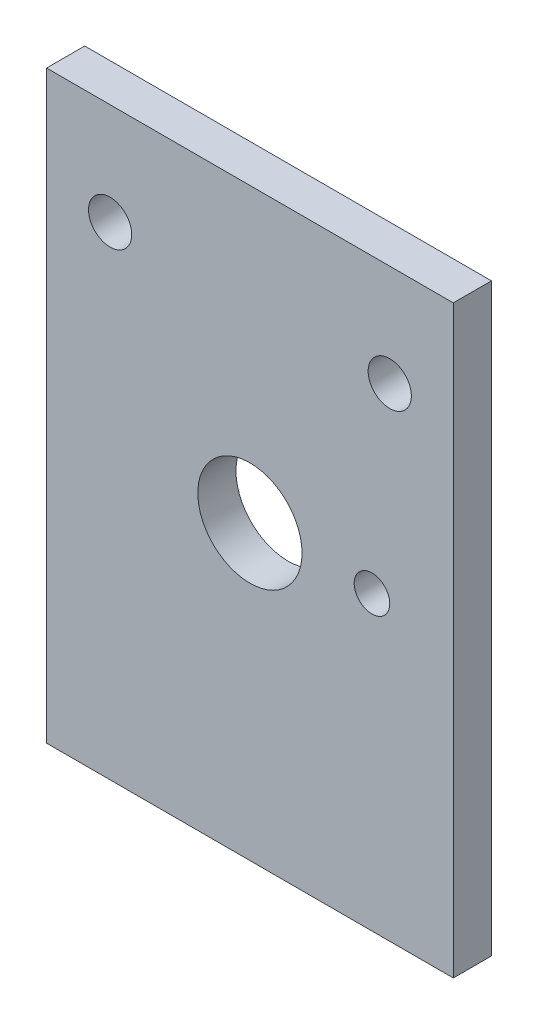
ISO-10303-21;
HEADER;
FILE_DESCRIPTION(('STEP AP214'),'2;1');
FILE_NAME('part.step','',(''),(''),'','','');
FILE_SCHEMA(('AUTOMOTIVE_DESIGN { 1 0 10303 214 1 1 1 1 }'));
ENDSEC;
DATA;
#1=APPLICATION_CONTEXT('core data for automotive mechanical design processes');
#2=APPLICATION_PROTOCOL_DEFINITION('international standard','automotive_design',2000,#1);
#3=PRODUCT_CONTEXT('',#1,'mechanical');
#4=PRODUCT('Part','Part','',(#3));
#5=PRODUCT_RELATED_PRODUCT_CATEGORY('part','',(#4));
#6=PRODUCT_DEFINITION_FORMATION('','',#4);
#7=PRODUCT_DEFINITION_CONTEXT('part definition',#1,'design');
#8=PRODUCT_DEFINITION('design','',#6,#7);
#9=PRODUCT_DEFINITION_SHAPE('','',#8);
#10=(LENGTH_UNIT() NAMED_UNIT(*) SI_UNIT(.MILLI.,.METRE.));
#11=(NAMED_UNIT(*) PLANE_ANGLE_UNIT() SI_UNIT($,.RADIAN.));
#12=(NAMED_UNIT(*) SI_UNIT($,.STERADIAN.) SOLID_ANGLE_UNIT());
#13=UNCERTAINTY_MEASURE_WITH_UNIT(LENGTH_MEASURE(1.E-05),#10,'distance_accuracy_value','');
#14=(GEOMETRIC_REPRESENTATION_CONTEXT(3) GLOBAL_UNCERTAINTY_ASSIGNED_CONTEXT((#13)) GLOBAL_UNIT_ASSIGNED_CONTEXT((#10,
#11,#12)) REPRESENTATION_CONTEXT('',''));
#15=CARTESIAN_POINT('',(0.,0.,0.));
#16=DIRECTION('',(0.,0.,1.));
#17=DIRECTION('',(1.,0.,0.));
#18=AXIS2_PLACEMENT_3D('',#15,#16,#17);
#19=CARTESIAN_POINT('',(16.,-23.,-3.));
#20=DIRECTION('',(1.,0.,0.));
#21=DIRECTION('',(0.,0.,-1.));
#22=AXIS2_PLACEMENT_3D('',#19,#20,#21);
#23=PLANE('',#22);
#24=DIRECTION('',(0.,1.,0.));
#25=VECTOR('',#24,1.);
#26=CARTESIAN_POINT('',(16.,-23.,0.));
#27=LINE('',#26,#25);
#28=CARTESIAN_POINT('',(16.,-23.,0.));
#29=VERTEX_POINT('',#28);
#30=CARTESIAN_POINT('',(16.,23.,0.));
#31=VERTEX_POINT('',#30);
#32=EDGE_CURVE('E104',#29,#31,#27,.T.);
#33=ORIENTED_EDGE('',*,*,#32,.F.);
#34=DIRECTION('',(0.,0.,1.));
#35=VECTOR('',#34,1.);
#36=CARTESIAN_POINT('',(16.,-23.,-3.));
#37=LINE('',#36,#35);
#38=CARTESIAN_POINT('',(16.,-23.,-3.));
#39=VERTEX_POINT('',#38);
#40=EDGE_CURVE('E11',#39,#29,#37,.T.);
#41=ORIENTED_EDGE('',*,*,#40,.F.);
#42=DIRECTION('',(0.,1.,0.));
#43=VECTOR('',#42,1.);
#44=CARTESIAN_POINT('',(16.,-23.,-3.));
#45=LINE('',#44,#43);
#46=CARTESIAN_POINT('',(16.,23.,-3.));
#47=VERTEX_POINT('',#46);
#48=EDGE_CURVE('E97',#39,#47,#45,.T.);
#49=ORIENTED_EDGE('',*,*,#48,.T.);
#50=DIRECTION('',(0.,0.,1.));
#51=VECTOR('',#50,1.);
#52=CARTESIAN_POINT('',(16.,23.,-3.));
#53=LINE('',#52,#51);
#54=EDGE_CURVE('E42',#47,#31,#53,.T.);
#55=ORIENTED_EDGE('',*,*,#54,.T.);
#56=EDGE_LOOP('',(#33,#41,#49,#55));
#57=FACE_BOUND('',#56,.T.);
#58=ADVANCED_FACE('F39',(#57),#23,.T.);
#59=CARTESIAN_POINT('',(-16.,-23.,-3.));
#60=DIRECTION('',(0.,-1.,0.));
#61=DIRECTION('',(0.,0.,-1.));
#62=AXIS2_PLACEMENT_3D('',#59,#60,#61);
#63=PLANE('',#62);
#64=DIRECTION('',(1.,0.,0.));
#65=VECTOR('',#64,1.);
#66=CARTESIAN_POINT('',(-16.,-23.,0.));
#67=LINE('',#66,#65);
#68=CARTESIAN_POINT('',(-16.,-23.,0.));
#69=VERTEX_POINT('',#68);
#70=EDGE_CURVE('E99',#69,#29,#67,.T.);
#71=ORIENTED_EDGE('',*,*,#70,.F.);
#72=DIRECTION('',(0.,0.,1.));
#73=VECTOR('',#72,1.);
#74=CARTESIAN_POINT('',(-16.,-23.,-3.));
#75=LINE('',#74,#73);
#76=CARTESIAN_POINT('',(-16.,-23.,-3.));
#77=VERTEX_POINT('',#76);
#78=EDGE_CURVE('E48',#77,#69,#75,.T.);
#79=ORIENTED_EDGE('',*,*,#78,.F.);
#80=DIRECTION('',(1.,0.,0.));
#81=VECTOR('',#80,1.);
#82=CARTESIAN_POINT('',(-16.,-23.,-3.));
#83=LINE('',#82,#81);
#84=EDGE_CURVE('E94',#77,#39,#83,.T.);
#85=ORIENTED_EDGE('',*,*,#84,.T.);
#86=ORIENTED_EDGE('',*,*,#40,.T.);
#87=EDGE_LOOP('',(#71,#79,#85,#86));
#88=FACE_BOUND('',#87,.T.);
#89=ADVANCED_FACE('F115',(#88),#63,.T.);
#90=CARTESIAN_POINT('',(-16.,-23.,-3.));
#91=DIRECTION('',(-1.,0.,0.));
#92=DIRECTION('',(0.,0.,1.));
#93=AXIS2_PLACEMENT_3D('',#90,#91,#92);
#94=PLANE('',#93);
#95=DIRECTION('',(0.,-1.,0.));
#96=VECTOR('',#95,1.);
#97=CARTESIAN_POINT('',(-16.,-23.,0.));
#98=LINE('',#97,#96);
#99=CARTESIAN_POINT('',(-16.,23.,0.));
#100=VERTEX_POINT('',#99);
#101=EDGE_CURVE('E89',#100,#69,#98,.T.);
#102=ORIENTED_EDGE('',*,*,#101,.F.);
#103=DIRECTION('',(0.,0.,1.));
#104=VECTOR('',#103,1.);
#105=CARTESIAN_POINT('',(-16.,23.,-3.));
#106=LINE('',#105,#104);
#107=CARTESIAN_POINT('',(-16.,23.,-3.));
#108=VERTEX_POINT('',#107);
#109=EDGE_CURVE('E84',#108,#100,#106,.T.);
#110=ORIENTED_EDGE('',*,*,#109,.F.);
#111=DIRECTION('',(0.,-1.,0.));
#112=VECTOR('',#111,1.);
#113=CARTESIAN_POINT('',(-16.,-23.,-3.));
#114=LINE('',#113,#112);
#115=EDGE_CURVE('E87',#108,#77,#114,.T.);
#116=ORIENTED_EDGE('',*,*,#115,.T.);
#117=ORIENTED_EDGE('',*,*,#78,.T.);
#118=EDGE_LOOP('',(#102,#110,#116,#117));
#119=FACE_BOUND('',#118,.T.);
#120=ADVANCED_FACE('F86',(#119),#94,.T.);
#121=CARTESIAN_POINT('',(-16.,23.,-3.));
#122=DIRECTION('',(0.,1.,0.));
#123=DIRECTION('',(0.,0.,1.));
#124=AXIS2_PLACEMENT_3D('',#121,#122,#123);
#125=PLANE('',#124);
#126=DIRECTION('',(-1.,0.,0.));
#127=VECTOR('',#126,1.);
#128=CARTESIAN_POINT('',(-16.,23.,0.));
#129=LINE('',#128,#127);
#130=EDGE_CURVE('E107',#31,#100,#129,.T.);
#131=ORIENTED_EDGE('',*,*,#130,.F.);
#132=ORIENTED_EDGE('',*,*,#54,.F.);
#133=DIRECTION('',(-1.,0.,0.));
#134=VECTOR('',#133,1.);
#135=CARTESIAN_POINT('',(-16.,23.,-3.));
#136=LINE('',#135,#134);
#137=EDGE_CURVE('E93',#47,#108,#136,.T.);
#138=ORIENTED_EDGE('',*,*,#137,.T.);
#139=ORIENTED_EDGE('',*,*,#109,.T.);
#140=EDGE_LOOP('',(#131,#132,#138,#139));
#141=FACE_BOUND('',#140,.T.);
#142=ADVANCED_FACE('F96',(#141),#125,.T.);
#143=CARTESIAN_POINT('',(0.,0.,-3.));
#144=DIRECTION('',(0.,0.,-1.));
#145=DIRECTION('',(-1.,0.,0.));
#146=AXIS2_PLACEMENT_3D('',#143,#144,#145);
#147=PLANE('',#146);
#148=CARTESIAN_POINT('',(-11.,15.,-3.));
#149=DIRECTION('',(0.,0.,-1.));
#150=DIRECTION('',(-1.,0.,0.));
#151=AXIS2_PLACEMENT_3D('',#148,#149,#150);
#152=CIRCLE('',#151,1.7);
#153=CARTESIAN_POINT('',(-12.7,15.,-3.));
#154=VERTEX_POINT('',#153);
#155=EDGE_CURVE('E156',#154,#154,#152,.T.);
#156=ORIENTED_EDGE('',*,*,#155,.F.);
#157=EDGE_LOOP('',(#156));
#158=FACE_BOUND('',#157,.T.);
#159=CARTESIAN_POINT('',(11.,15.,-3.));
#160=DIRECTION('',(0.,0.,-1.));
#161=DIRECTION('',(-1.,0.,0.));
#162=AXIS2_PLACEMENT_3D('',#159,#160,#161);
#163=CIRCLE('',#162,1.7);
#164=CARTESIAN_POINT('',(9.3,15.,-3.));
#165=VERTEX_POINT('',#164);
#166=EDGE_CURVE('E160',#165,#165,#163,.T.);
#167=ORIENTED_EDGE('',*,*,#166,.F.);
#168=EDGE_LOOP('',(#167));
#169=FACE_BOUND('',#168,.T.);
#170=CARTESIAN_POINT('',(0.,0.,-3.));
#171=DIRECTION('',(0.,0.,-1.));
#172=DIRECTION('',(-1.,0.,0.));
#173=AXIS2_PLACEMENT_3D('',#170,#171,#172);
#174=CIRCLE('',#173,4.1);
#175=CARTESIAN_POINT('',(-4.1,0.,-3.));
#176=VERTEX_POINT('',#175);
#177=EDGE_CURVE('E108',#176,#176,#174,.T.);
#178=ORIENTED_EDGE('',*,*,#177,.F.);
#179=EDGE_LOOP('',(#178));
#180=FACE_BOUND('',#179,.T.);
#181=CARTESIAN_POINT('',(9.6,0.,-3.));
#182=DIRECTION('',(0.,0.,-1.));
#183=DIRECTION('',(-1.,0.,0.));
#184=AXIS2_PLACEMENT_3D('',#181,#182,#183);
#185=CIRCLE('',#184,1.4);
#186=CARTESIAN_POINT('',(8.2,0.,-3.));
#187=VERTEX_POINT('',#186);
#188=EDGE_CURVE('E173',#187,#187,#185,.T.);
#189=ORIENTED_EDGE('',*,*,#188,.F.);
#190=EDGE_LOOP('',(#189));
#191=FACE_BOUND('',#190,.T.);
#192=ORIENTED_EDGE('',*,*,#48,.F.);
#193=ORIENTED_EDGE('',*,*,#84,.F.);
#194=ORIENTED_EDGE('',*,*,#115,.F.);
#195=ORIENTED_EDGE('',*,*,#137,.F.);
#196=EDGE_LOOP('',(#192,#193,#194,#195));
#197=FACE_BOUND('',#196,.T.);
#198=ADVANCED_FACE('F92',(#158,#169,#180,#191,#197),#147,.T.);
#199=CARTESIAN_POINT('',(0.,0.,0.));
#200=DIRECTION('',(0.,0.,-1.));
#201=DIRECTION('',(-1.,0.,0.));
#202=AXIS2_PLACEMENT_3D('',#199,#200,#201);
#203=PLANE('',#202);
#204=CARTESIAN_POINT('',(-11.,15.,0.));
#205=DIRECTION('',(0.,0.,1.));
#206=DIRECTION('',(1.,0.,0.));
#207=AXIS2_PLACEMENT_3D('',#204,#205,#206);
#208=CIRCLE('',#207,1.7);
#209=CARTESIAN_POINT('',(-9.3,15.,0.));
#210=VERTEX_POINT('',#209);
#211=EDGE_CURVE('E159',#210,#210,#208,.T.);
#212=ORIENTED_EDGE('',*,*,#211,.F.);
#213=EDGE_LOOP('',(#212));
#214=FACE_BOUND('',#213,.T.);
#215=CARTESIAN_POINT('',(11.,15.,0.));
#216=DIRECTION('',(0.,0.,1.));
#217=DIRECTION('',(1.,0.,0.));
#218=AXIS2_PLACEMENT_3D('',#215,#216,#217);
#219=CIRCLE('',#218,1.7);
#220=CARTESIAN_POINT('',(12.7,15.,0.));
#221=VERTEX_POINT('',#220);
#222=EDGE_CURVE('E161',#221,#221,#219,.T.);
#223=ORIENTED_EDGE('',*,*,#222,.F.);
#224=EDGE_LOOP('',(#223));
#225=FACE_BOUND('',#224,.T.);
#226=CARTESIAN_POINT('',(0.,0.,0.));
#227=DIRECTION('',(0.,0.,1.));
#228=DIRECTION('',(1.,0.,0.));
#229=AXIS2_PLACEMENT_3D('',#226,#227,#228);
#230=CIRCLE('',#229,4.1);
#231=CARTESIAN_POINT('',(4.1,0.,0.));
#232=VERTEX_POINT('',#231);
#233=EDGE_CURVE('E170',#232,#232,#230,.T.);
#234=ORIENTED_EDGE('',*,*,#233,.F.);
#235=EDGE_LOOP('',(#234));
#236=FACE_BOUND('',#235,.T.);
#237=CARTESIAN_POINT('',(9.6,0.,0.));
#238=DIRECTION('',(0.,0.,1.));
#239=DIRECTION('',(1.,0.,0.));
#240=AXIS2_PLACEMENT_3D('',#237,#238,#239);
#241=CIRCLE('',#240,1.4);
#242=CARTESIAN_POINT('',(11.,0.,0.));
#243=VERTEX_POINT('',#242);
#244=EDGE_CURVE('E169',#243,#243,#241,.T.);
#245=ORIENTED_EDGE('',*,*,#244,.F.);
#246=EDGE_LOOP('',(#245));
#247=FACE_BOUND('',#246,.T.);
#248=ORIENTED_EDGE('',*,*,#32,.T.);
#249=ORIENTED_EDGE('',*,*,#130,.T.);
#250=ORIENTED_EDGE('',*,*,#101,.T.);
#251=ORIENTED_EDGE('',*,*,#70,.T.);
#252=EDGE_LOOP('',(#248,#249,#250,#251));
#253=FACE_BOUND('',#252,.T.);
#254=ADVANCED_FACE('F114',(#214,#225,#236,#247,#253),#203,.F.);
#255=CARTESIAN_POINT('',(9.6,0.,-4.));
#256=DIRECTION('',(0.,0.,1.));
#257=DIRECTION('',(1.,0.,0.));
#258=AXIS2_PLACEMENT_3D('',#255,#256,#257);
#259=CYLINDRICAL_SURFACE('',#258,1.4);
#260=ORIENTED_EDGE('',*,*,#188,.T.);
#261=EDGE_LOOP('',(#260));
#262=FACE_BOUND('',#261,.T.);
#263=ORIENTED_EDGE('',*,*,#244,.T.);
#264=EDGE_LOOP('',(#263));
#265=FACE_BOUND('',#264,.T.);
#266=ADVANCED_FACE('F133',(#262,#265),#259,.F.);
#267=CARTESIAN_POINT('',(0.,0.,-4.));
#268=DIRECTION('',(0.,0.,1.));
#269=DIRECTION('',(1.,0.,0.));
#270=AXIS2_PLACEMENT_3D('',#267,#268,#269);
#271=CYLINDRICAL_SURFACE('',#270,4.1);
#272=ORIENTED_EDGE('',*,*,#177,.T.);
#273=EDGE_LOOP('',(#272));
#274=FACE_BOUND('',#273,.T.);
#275=ORIENTED_EDGE('',*,*,#233,.T.);
#276=EDGE_LOOP('',(#275));
#277=FACE_BOUND('',#276,.T.);
#278=ADVANCED_FACE('F140',(#274,#277),#271,.F.);
#279=CARTESIAN_POINT('',(11.,15.,-4.));
#280=DIRECTION('',(0.,0.,1.));
#281=DIRECTION('',(1.,0.,0.));
#282=AXIS2_PLACEMENT_3D('',#279,#280,#281);
#283=CYLINDRICAL_SURFACE('',#282,1.7);
#284=ORIENTED_EDGE('',*,*,#166,.T.);
#285=EDGE_LOOP('',(#284));
#286=FACE_BOUND('',#285,.T.);
#287=ORIENTED_EDGE('',*,*,#222,.T.);
#288=EDGE_LOOP('',(#287));
#289=FACE_BOUND('',#288,.T.);
#290=ADVANCED_FACE('F144',(#286,#289),#283,.F.);
#291=CARTESIAN_POINT('',(-11.,15.,-4.));
#292=DIRECTION('',(0.,0.,1.));
#293=DIRECTION('',(1.,0.,0.));
#294=AXIS2_PLACEMENT_3D('',#291,#292,#293);
#295=CYLINDRICAL_SURFACE('',#294,1.7);
#296=ORIENTED_EDGE('',*,*,#155,.T.);
#297=EDGE_LOOP('',(#296));
#298=FACE_BOUND('',#297,.T.);
#299=ORIENTED_EDGE('',*,*,#211,.T.);
#300=EDGE_LOOP('',(#299));
#301=FACE_BOUND('',#300,.T.);
#302=ADVANCED_FACE('F148',(#298,#301),#295,.F.);
#303=CLOSED_SHELL('',(#58,#89,#120,#142,#198,#254,#266,#278,#290,#302));
#304=MANIFOLD_SOLID_BREP('B2',#303);
#305=ADVANCED_BREP_SHAPE_REPRESENTATION('',(#18,#304),#14);
#306=SHAPE_DEFINITION_REPRESENTATION(#9,#305);
ENDSEC;
END-ISO-10303-21;
